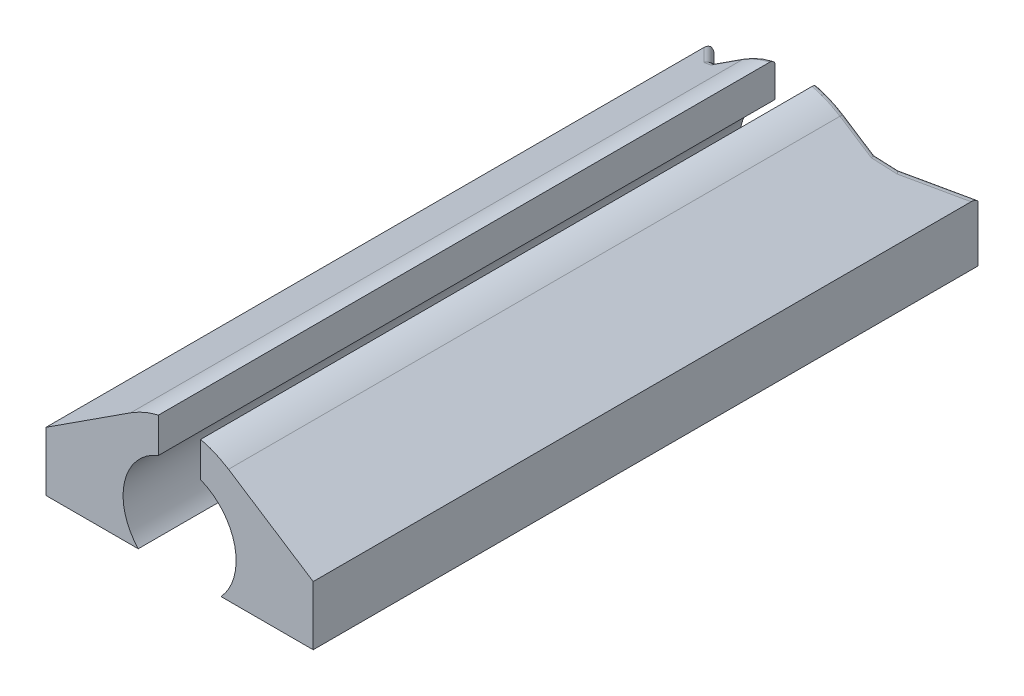
ISO-10303-21;
HEADER;
FILE_DESCRIPTION(('STEP AP214'),'2;1');
FILE_NAME('part.step','',(''),(''),'','','');
FILE_SCHEMA(('AUTOMOTIVE_DESIGN { 1 0 10303 214 1 1 1 1 }'));
ENDSEC;
DATA;
#1=APPLICATION_CONTEXT('core data for automotive mechanical design processes');
#2=APPLICATION_PROTOCOL_DEFINITION('international standard','automotive_design',2000,#1);
#3=PRODUCT_CONTEXT('',#1,'mechanical');
#4=PRODUCT('Part','Part','',(#3));
#5=PRODUCT_RELATED_PRODUCT_CATEGORY('part','',(#4));
#6=PRODUCT_DEFINITION_FORMATION('','',#4);
#7=PRODUCT_DEFINITION_CONTEXT('part definition',#1,'design');
#8=PRODUCT_DEFINITION('design','',#6,#7);
#9=PRODUCT_DEFINITION_SHAPE('','',#8);
#10=(LENGTH_UNIT() NAMED_UNIT(*) SI_UNIT(.MILLI.,.METRE.));
#11=(NAMED_UNIT(*) PLANE_ANGLE_UNIT() SI_UNIT($,.RADIAN.));
#12=(NAMED_UNIT(*) SI_UNIT($,.STERADIAN.) SOLID_ANGLE_UNIT());
#13=UNCERTAINTY_MEASURE_WITH_UNIT(LENGTH_MEASURE(1.E-05),#10,'distance_accuracy_value','');
#14=(GEOMETRIC_REPRESENTATION_CONTEXT(3) GLOBAL_UNCERTAINTY_ASSIGNED_CONTEXT((#13)) GLOBAL_UNIT_ASSIGNED_CONTEXT((#10,
#11,#12)) REPRESENTATION_CONTEXT('',''));
#15=CARTESIAN_POINT('',(0.,0.,0.));
#16=DIRECTION('',(0.,0.,1.));
#17=DIRECTION('',(1.,0.,0.));
#18=AXIS2_PLACEMENT_3D('',#15,#16,#17);
#19=CARTESIAN_POINT('',(0.,0.,-60.));
#20=DIRECTION('',(0.,0.,1.));
#21=DIRECTION('',(-1.,0.,0.));
#22=AXIS2_PLACEMENT_3D('',#19,#20,#21);
#23=PLANE('',#22);
#24=DIRECTION('',(0.,1.,0.));
#25=VECTOR('',#24,1.);
#26=CARTESIAN_POINT('',(14.8,10.4830044212181,-60.));
#27=LINE('',#26,#25);
#28=CARTESIAN_POINT('',(14.8,-7.5,-60.));
#29=VERTEX_POINT('',#28);
#30=CARTESIAN_POINT('',(14.8,9.7450540738367,-60.));
#31=VERTEX_POINT('',#30);
#32=EDGE_CURVE('E210',#29,#31,#27,.T.);
#33=ORIENTED_EDGE('',*,*,#32,.F.);
#34=DIRECTION('',(-1.,0.,0.));
#35=VECTOR('',#34,1.);
#36=CARTESIAN_POINT('',(0.,-7.5,-60.));
#37=LINE('',#36,#35);
#38=CARTESIAN_POINT('',(8.04673846971554,-7.5,-60.));
#39=VERTEX_POINT('',#38);
#40=EDGE_CURVE('E187',#29,#39,#37,.T.);
#41=ORIENTED_EDGE('',*,*,#40,.T.);
#42=CARTESIAN_POINT('',(0.,0.,-60.));
#43=DIRECTION('',(0.,0.,-1.));
#44=DIRECTION('',(-1.,0.,0.));
#45=AXIS2_PLACEMENT_3D('',#42,#43,#44);
#46=CIRCLE('',#45,11.);
#47=CARTESIAN_POINT('',(4.10000000000001,10.2073502928037,-60.));
#48=VERTEX_POINT('',#47);
#49=EDGE_CURVE('E161',#48,#39,#46,.T.);
#50=ORIENTED_EDGE('',*,*,#49,.F.);
#51=DIRECTION('',(0.,-1.,0.));
#52=VECTOR('',#51,1.);
#53=CARTESIAN_POINT('',(4.10000000000001,0.,-60.));
#54=LINE('',#53,#52);
#55=CARTESIAN_POINT('',(4.10000000000001,15.9824904192056,-60.));
#56=VERTEX_POINT('',#55);
#57=EDGE_CURVE('E172',#56,#48,#54,.T.);
#58=ORIENTED_EDGE('',*,*,#57,.F.);
#59=CARTESIAN_POINT('',(0.,0.,-60.));
#60=DIRECTION('',(0.,0.,-1.));
#61=DIRECTION('',(-1.,0.,0.));
#62=AXIS2_PLACEMENT_3D('',#59,#60,#61);
#63=CIRCLE('',#62,16.5);
#64=CARTESIAN_POINT('',(8.97575971599341,13.8450618460428,-60.));
#65=VERTEX_POINT('',#64);
#66=EDGE_CURVE('E215',#65,#56,#63,.F.);
#67=ORIENTED_EDGE('',*,*,#66,.F.);
#68=DIRECTION('',(-0.839094657335927,0.543985437332934,0.));
#69=VECTOR('',#68,1.);
#70=CARTESIAN_POINT('',(8.97575971599341,13.8450618460428,-60.));
#71=LINE('',#70,#69);
#72=CARTESIAN_POINT('',(14.8754013810746,10.0203215462104,-60.));
#73=VERTEX_POINT('',#72);
#74=EDGE_CURVE('E218',#73,#65,#71,.T.);
#75=ORIENTED_EDGE('',*,*,#74,.F.);
#76=CARTESIAN_POINT('',(16.8,8.772603410654,-60.));
#77=DIRECTION('',(0.,0.,-1.));
#78=DIRECTION('',(0.839094657335927,-0.543985437332934,0.));
#79=AXIS2_PLACEMENT_3D('',#76,#77,#78);
#80=ELLIPSE('',#79,2.29366091429529,1.);
#81=EDGE_CURVE('E12',#31,#73,#80,.T.);
#82=ORIENTED_EDGE('',*,*,#81,.F.);
#83=EDGE_LOOP('',(#33,#41,#50,#58,#67,#75,#82));
#84=FACE_BOUND('',#83,.T.);
#85=ADVANCED_FACE('F53',(#84),#23,.F.);
#86=CARTESIAN_POINT('',(0.,-7.5,60.));
#87=DIRECTION('',(0.,1.,0.));
#88=DIRECTION('',(1.,0.,0.));
#89=AXIS2_PLACEMENT_3D('',#86,#87,#88);
#90=PLANE('',#89);
#91=DIRECTION('',(0.,0.,-1.));
#92=VECTOR('',#91,1.);
#93=CARTESIAN_POINT('',(26.,-7.5,60.));
#94=LINE('',#93,#92);
#95=CARTESIAN_POINT('',(26.,-7.5,60.));
#96=VERTEX_POINT('',#95);
#97=CARTESIAN_POINT('',(26.,-7.5,-69.3788342917538));
#98=VERTEX_POINT('',#97);
#99=EDGE_CURVE('E171',#96,#98,#94,.T.);
#100=ORIENTED_EDGE('',*,*,#99,.F.);
#101=DIRECTION('',(-1.,0.,0.));
#102=VECTOR('',#101,1.);
#103=CARTESIAN_POINT('',(0.,-7.5,60.));
#104=LINE('',#103,#102);
#105=CARTESIAN_POINT('',(8.04673846971554,-7.5,60.));
#106=VERTEX_POINT('',#105);
#107=EDGE_CURVE('E150',#96,#106,#104,.T.);
#108=ORIENTED_EDGE('',*,*,#107,.T.);
#109=DIRECTION('',(0.,0.,-1.));
#110=VECTOR('',#109,1.);
#111=CARTESIAN_POINT('',(8.04673846971554,-7.5,60.));
#112=LINE('',#111,#110);
#113=EDGE_CURVE('E158',#106,#39,#112,.T.);
#114=ORIENTED_EDGE('',*,*,#113,.T.);
#115=ORIENTED_EDGE('',*,*,#40,.F.);
#116=DIRECTION('',(0.866025403784435,0.,-0.500000000000006));
#117=VECTOR('',#116,1.);
#118=CARTESIAN_POINT('',(-48.2615242270666,-7.49999999999999,-23.5914120119944));
#119=LINE('',#118,#117);
#120=CARTESIAN_POINT('',(17.6392304845414,-7.5,-61.6392304845414));
#121=VERTEX_POINT('',#120);
#122=EDGE_CURVE('E213',#121,#29,#119,.F.);
#123=ORIENTED_EDGE('',*,*,#122,.F.);
#124=DIRECTION('',(0.707106781186552,0.,-0.707106781186543));
#125=VECTOR('',#124,1.);
#126=CARTESIAN_POINT('',(26.,-7.5,-69.9999999999999));
#127=LINE('',#126,#125);
#128=CARTESIAN_POINT('',(25.1514718625761,-7.5,-69.151471862576));
#129=VERTEX_POINT('',#128);
#130=EDGE_CURVE('E177',#121,#129,#127,.T.);
#131=ORIENTED_EDGE('',*,*,#130,.T.);
#132=DIRECTION('',(-0.965925826289067,0.,0.258819045102525));
#133=VECTOR('',#132,1.);
#134=CARTESIAN_POINT('',(26.,-7.5,-69.3788342917538));
#135=LINE('',#134,#133);
#136=EDGE_CURVE('E202',#98,#129,#135,.T.);
#137=ORIENTED_EDGE('',*,*,#136,.F.);
#138=EDGE_LOOP('',(#100,#108,#114,#115,#123,#131,#137));
#139=FACE_BOUND('',#138,.T.);
#140=ADVANCED_FACE('F168',(#139),#90,.F.);
#141=CARTESIAN_POINT('',(0.,0.,60.));
#142=DIRECTION('',(0.,0.,-1.));
#143=DIRECTION('',(1.,0.,0.));
#144=AXIS2_PLACEMENT_3D('',#141,#142,#143);
#145=CYLINDRICAL_SURFACE('',#144,11.);
#146=ORIENTED_EDGE('',*,*,#49,.T.);
#147=ORIENTED_EDGE('',*,*,#113,.F.);
#148=CARTESIAN_POINT('',(0.,0.,60.));
#149=DIRECTION('',(0.,0.,-1.));
#150=DIRECTION('',(-1.,0.,0.));
#151=AXIS2_PLACEMENT_3D('',#148,#149,#150);
#152=CIRCLE('',#151,11.);
#153=CARTESIAN_POINT('',(4.10000000000001,10.2073502928037,60.));
#154=VERTEX_POINT('',#153);
#155=EDGE_CURVE('E146',#154,#106,#152,.T.);
#156=ORIENTED_EDGE('',*,*,#155,.F.);
#157=DIRECTION('',(0.,0.,-1.));
#158=VECTOR('',#157,1.);
#159=CARTESIAN_POINT('',(4.10000000000001,10.2073502928037,60.));
#160=LINE('',#159,#158);
#161=EDGE_CURVE('E166',#154,#48,#160,.T.);
#162=ORIENTED_EDGE('',*,*,#161,.T.);
#163=EDGE_LOOP('',(#146,#147,#156,#162));
#164=FACE_BOUND('',#163,.T.);
#165=ADVANCED_FACE('F159',(#164),#145,.F.);
#166=CARTESIAN_POINT('',(4.10000000000001,0.,60.));
#167=DIRECTION('',(-1.,0.,0.));
#168=DIRECTION('',(0.,0.,-1.));
#169=AXIS2_PLACEMENT_3D('',#166,#167,#168);
#170=PLANE('',#169);
#171=ORIENTED_EDGE('',*,*,#57,.T.);
#172=ORIENTED_EDGE('',*,*,#161,.F.);
#173=DIRECTION('',(0.,-1.,0.));
#174=VECTOR('',#173,1.);
#175=CARTESIAN_POINT('',(4.10000000000001,0.,60.));
#176=LINE('',#175,#174);
#177=CARTESIAN_POINT('',(4.10000000000001,17.0129362545094,60.));
#178=VERTEX_POINT('',#177);
#179=EDGE_CURVE('E153',#178,#154,#176,.T.);
#180=ORIENTED_EDGE('',*,*,#179,.F.);
#181=DIRECTION('',(0.,0.,-1.));
#182=VECTOR('',#181,1.);
#183=CARTESIAN_POINT('',(4.10000000000001,17.0129362545094,60.));
#184=LINE('',#183,#182);
#185=CARTESIAN_POINT('',(4.10000000000001,17.0129362545094,-59.));
#186=VERTEX_POINT('',#185);
#187=EDGE_CURVE('E197',#178,#186,#184,.T.);
#188=ORIENTED_EDGE('',*,*,#187,.T.);
#189=CARTESIAN_POINT('',(4.10000000000001,15.9824904192056,-60.));
#190=CARTESIAN_POINT('',(4.10000000000001,16.0418203107306,-60.0000423199138));
#191=CARTESIAN_POINT('',(4.10000000000001,16.101149826966,-59.995048083426));
#192=CARTESIAN_POINT('',(4.10000000000001,16.2181655923714,-59.9752613891248));
#193=CARTESIAN_POINT('',(4.10000000000001,16.2758514670217,-59.9604667165167));
#194=CARTESIAN_POINT('',(4.10000000000001,16.3879581507829,-59.9213371553985));
#195=CARTESIAN_POINT('',(4.10000000000001,16.4423760578724,-59.8969939279167));
#196=CARTESIAN_POINT('',(4.10000000000001,16.5462356142313,-59.8393784946179));
#197=CARTESIAN_POINT('',(4.10000000000001,16.5956796340957,-59.8061105703727));
#198=CARTESIAN_POINT('',(4.10000000000001,16.6872911081194,-59.7321231346246));
#199=CARTESIAN_POINT('',(4.10000000000001,16.7295655385417,-59.691536198512));
#200=CARTESIAN_POINT('',(4.10000000000001,16.8064634693826,-59.6036405859423));
#201=CARTESIAN_POINT('',(4.10000000000001,16.8410859642524,-59.556331027399));
#202=CARTESIAN_POINT('',(4.10000000000001,16.9006235057997,-59.4578104061437));
#203=CARTESIAN_POINT('',(4.10000000000001,16.9257884532279,-59.4067501266514));
#204=CARTESIAN_POINT('',(4.10000000000001,16.9669210088798,-59.3010747318077));
#205=CARTESIAN_POINT('',(4.10000000000001,16.9828978775942,-59.2464632576666));
#206=CARTESIAN_POINT('',(4.10000000000001,17.0003053773164,-59.1594894427613));
#207=CARTESIAN_POINT('',(4.10000000000001,17.0050396330188,-59.127753558029));
#208=CARTESIAN_POINT('',(4.10000000000001,17.0113537650882,-59.0640169949094));
#209=CARTESIAN_POINT('',(4.10000000000001,17.0129382923981,-59.0320167771123));
#210=CARTESIAN_POINT('',(4.10000000000001,17.0129362545094,-59.));
#211=B_SPLINE_CURVE_WITH_KNOTS('',3,(#189,#190,#191,#192,#193,#194,#195,#196,#197,#198,#199,
#200,#201,#202,#203,#204,#205,#206,#207,#208,#209,#210),.UNSPECIFIED.,.F.,.F.,(4,2,2,2,2,2,2,2,
2,2,4),(0.,0.177781479469305,0.355603149382926,0.533580462038742,0.71147254332309,
0.886417610297477,1.06138565333153,1.23133630159282,1.40111535825444,1.49723608923946,
1.59321478096192),.UNSPECIFIED.);
#212=EDGE_CURVE('E240',#56,#186,#211,.T.);
#213=ORIENTED_EDGE('',*,*,#212,.F.);
#214=EDGE_LOOP('',(#171,#172,#180,#188,#213));
#215=FACE_BOUND('',#214,.T.);
#216=ADVANCED_FACE('F252',(#215),#170,.T.);
#217=CARTESIAN_POINT('',(0.,0.,60.));
#218=DIRECTION('',(0.,0.,-1.));
#219=DIRECTION('',(1.,0.,0.));
#220=AXIS2_PLACEMENT_3D('',#217,#218,#219);
#221=CYLINDRICAL_SURFACE('',#220,17.5);
#222=ORIENTED_EDGE('',*,*,#187,.F.);
#223=CARTESIAN_POINT('',(0.,0.,60.));
#224=DIRECTION('',(0.,0.,-1.));
#225=DIRECTION('',(-1.,0.,0.));
#226=AXIS2_PLACEMENT_3D('',#223,#224,#225);
#227=CIRCLE('',#226,17.5);
#228=CARTESIAN_POINT('',(9.51974515332635,14.6841565033787,60.));
#229=VERTEX_POINT('',#228);
#230=EDGE_CURVE('E180',#178,#229,#227,.T.);
#231=ORIENTED_EDGE('',*,*,#230,.T.);
#232=DIRECTION('',(0.,0.,-1.));
#233=VECTOR('',#232,1.);
#234=CARTESIAN_POINT('',(9.51974515332635,14.6841565033787,60.));
#235=LINE('',#234,#233);
#236=CARTESIAN_POINT('',(9.51974515332635,14.6841565033787,-59.));
#237=VERTEX_POINT('',#236);
#238=EDGE_CURVE('E194',#229,#237,#235,.T.);
#239=ORIENTED_EDGE('',*,*,#238,.T.);
#240=CARTESIAN_POINT('',(0.,0.,-59.));
#241=DIRECTION('',(0.,0.,-1.));
#242=DIRECTION('',(-1.,0.,0.));
#243=AXIS2_PLACEMENT_3D('',#240,#241,#242);
#244=CIRCLE('',#243,17.5);
#245=EDGE_CURVE('E237',#186,#237,#244,.T.);
#246=ORIENTED_EDGE('',*,*,#245,.F.);
#247=EDGE_LOOP('',(#222,#231,#239,#246));
#248=FACE_BOUND('',#247,.T.);
#249=ADVANCED_FACE('F257',(#248),#221,.T.);
#250=CARTESIAN_POINT('',(9.51974515332634,14.6841565033787,60.));
#251=DIRECTION('',(0.543985437332934,0.839094657335927,0.));
#252=DIRECTION('',(0.839094657335927,-0.543985437332934,0.));
#253=AXIS2_PLACEMENT_3D('',#250,#251,#252);
#254=PLANE('',#253);
#255=ORIENTED_EDGE('',*,*,#238,.F.);
#256=DIRECTION('',(-0.839094657335927,0.543985437332934,0.));
#257=VECTOR('',#256,1.);
#258=CARTESIAN_POINT('',(9.51974515332634,14.6841565033787,60.));
#259=LINE('',#258,#257);
#260=CARTESIAN_POINT('',(26.,4.,60.));
#261=VERTEX_POINT('',#260);
#262=EDGE_CURVE('E183',#261,#229,#259,.T.);
#263=ORIENTED_EDGE('',*,*,#262,.F.);
#264=DIRECTION('',(0.,0.,-1.));
#265=VECTOR('',#264,1.);
#266=CARTESIAN_POINT('',(26.,4.,60.));
#267=LINE('',#266,#265);
#268=CARTESIAN_POINT('',(26.,4.,-68.0418010002939));
#269=VERTEX_POINT('',#268);
#270=EDGE_CURVE('E191',#261,#269,#267,.T.);
#271=ORIENTED_EDGE('',*,*,#270,.T.);
#272=DIRECTION('',(-0.64278537377085,0.416718042005079,0.642785373770843));
#273=VECTOR('',#272,1.);
#274=CARTESIAN_POINT('',(25.9605468898136,4.02557746877691,-68.0023478901075));
#275=LINE('',#274,#273);
#276=CARTESIAN_POINT('',(18.7972303292566,8.66955876204451,-60.8390313295506));
#277=VERTEX_POINT('',#276);
#278=EDGE_CURVE('E222',#277,#269,#275,.F.);
#279=ORIENTED_EDGE('',*,*,#278,.F.);
#280=DIRECTION('',(-0.755146847022509,0.489562034791587,0.435984235406149));
#281=VECTOR('',#280,1.);
#282=CARTESIAN_POINT('',(18.1227969693985,9.10679420742223,-60.4496470476861));
#283=LINE('',#282,#281);
#284=CARTESIAN_POINT('',(15.6119346297641,10.7345873723143,-59.));
#285=VERTEX_POINT('',#284);
#286=EDGE_CURVE('E220',#285,#277,#283,.F.);
#287=ORIENTED_EDGE('',*,*,#286,.F.);
#288=DIRECTION('',(-0.839094657335927,0.543985437332934,0.));
#289=VECTOR('',#288,1.);
#290=CARTESIAN_POINT('',(14.8,11.2609649517643,-59.));
#291=LINE('',#290,#289);
#292=EDGE_CURVE('E225',#237,#285,#291,.F.);
#293=ORIENTED_EDGE('',*,*,#292,.F.);
#294=EDGE_LOOP('',(#255,#263,#271,#279,#287,#293));
#295=FACE_BOUND('',#294,.T.);
#296=ADVANCED_FACE('F290',(#295),#254,.T.);
#297=CARTESIAN_POINT('',(26.,0.,60.));
#298=DIRECTION('',(1.,0.,0.));
#299=DIRECTION('',(0.,0.,1.));
#300=AXIS2_PLACEMENT_3D('',#297,#298,#299);
#301=PLANE('',#300);
#302=ORIENTED_EDGE('',*,*,#270,.F.);
#303=DIRECTION('',(0.,1.,0.));
#304=VECTOR('',#303,1.);
#305=CARTESIAN_POINT('',(26.,0.,60.));
#306=LINE('',#305,#304);
#307=EDGE_CURVE('E185',#96,#261,#306,.T.);
#308=ORIENTED_EDGE('',*,*,#307,.F.);
#309=ORIENTED_EDGE('',*,*,#99,.T.);
#310=DIRECTION('',(0.,-1.,0.));
#311=VECTOR('',#310,1.);
#312=CARTESIAN_POINT('',(26.,-7.5,-69.3788342917538));
#313=LINE('',#312,#311);
#314=CARTESIAN_POINT('',(26.,3.46199707217257,-69.3788342917538));
#315=VERTEX_POINT('',#314);
#316=EDGE_CURVE('E165',#315,#98,#313,.T.);
#317=ORIENTED_EDGE('',*,*,#316,.F.);
#318=CARTESIAN_POINT('',(26.,2.8082393431333,-68.5857864376268));
#319=DIRECTION('',(-1.,0.,0.));
#320=DIRECTION('',(0.,-0.543985437332939,-0.839094657335924));
#321=AXIS2_PLACEMENT_3D('',#318,#319,#320);
#322=ELLIPSE('',#321,1.55572923841371,1.);
#323=EDGE_CURVE('E230',#269,#315,#322,.T.);
#324=ORIENTED_EDGE('',*,*,#323,.F.);
#325=EDGE_LOOP('',(#302,#308,#309,#317,#324));
#326=FACE_BOUND('',#325,.T.);
#327=ADVANCED_FACE('F288',(#326),#301,.T.);
#328=CARTESIAN_POINT('',(0.,0.,60.));
#329=DIRECTION('',(0.,0.,1.));
#330=DIRECTION('',(-1.,0.,0.));
#331=AXIS2_PLACEMENT_3D('',#328,#329,#330);
#332=PLANE('',#331);
#333=ORIENTED_EDGE('',*,*,#107,.F.);
#334=ORIENTED_EDGE('',*,*,#307,.T.);
#335=ORIENTED_EDGE('',*,*,#262,.T.);
#336=ORIENTED_EDGE('',*,*,#230,.F.);
#337=ORIENTED_EDGE('',*,*,#179,.T.);
#338=ORIENTED_EDGE('',*,*,#155,.T.);
#339=EDGE_LOOP('',(#333,#334,#335,#336,#337,#338));
#340=FACE_BOUND('',#339,.T.);
#341=ADVANCED_FACE('F148',(#340),#332,.T.);
#342=CARTESIAN_POINT('',(26.,11.,-69.9999999999999));
#343=DIRECTION('',(0.707106781186543,0.,0.707106781186552));
#344=DIRECTION('',(-0.707106781186552,0.,0.707106781186543));
#345=AXIS2_PLACEMENT_3D('',#342,#343,#344);
#346=PLANE('',#345);
#347=DIRECTION('',(0.,1.,0.));
#348=VECTOR('',#347,1.);
#349=CARTESIAN_POINT('',(25.1514718625761,4.,-69.151471862576));
#350=LINE('',#349,#348);
#351=CARTESIAN_POINT('',(25.1514718625761,2.89992287090742,-69.151471862576));
#352=VERTEX_POINT('',#351);
#353=EDGE_CURVE('E207',#129,#352,#350,.T.);
#354=ORIENTED_EDGE('',*,*,#353,.F.);
#355=ORIENTED_EDGE('',*,*,#130,.F.);
#356=DIRECTION('',(0.,-1.,0.));
#357=VECTOR('',#356,1.);
#358=CARTESIAN_POINT('',(17.6392304845414,-7.5,-61.6392304845414));
#359=LINE('',#358,#357);
#360=CARTESIAN_POINT('',(17.6392304845414,7.77011227761314,-61.6392304845414));
#361=VERTEX_POINT('',#360);
#362=EDGE_CURVE('E205',#361,#121,#359,.T.);
#363=ORIENTED_EDGE('',*,*,#362,.F.);
#364=DIRECTION('',(-0.64278537377085,0.416718042005079,0.642785373770843));
#365=VECTOR('',#364,1.);
#366=CARTESIAN_POINT('',(17.1972132932594,8.05667221814671,-61.1972132932594));
#367=LINE('',#366,#365);
#368=EDGE_CURVE('E227',#352,#361,#367,.T.);
#369=ORIENTED_EDGE('',*,*,#368,.F.);
#370=EDGE_LOOP('',(#354,#355,#363,#369));
#371=FACE_BOUND('',#370,.T.);
#372=ADVANCED_FACE('F268',(#371),#346,.F.);
#373=CARTESIAN_POINT('',(26.,0.,-69.3788342917538));
#374=DIRECTION('',(-0.258819045102525,0.,-0.965925826289067));
#375=DIRECTION('',(0.,1.,0.));
#376=AXIS2_PLACEMENT_3D('',#373,#374,#375);
#377=PLANE('',#376);
#378=ORIENTED_EDGE('',*,*,#316,.T.);
#379=ORIENTED_EDGE('',*,*,#136,.T.);
#380=ORIENTED_EDGE('',*,*,#353,.T.);
#381=CARTESIAN_POINT('',(27.0833235151543,2.10592022929781,-69.6691099527811));
#382=DIRECTION('',(0.258819045102525,0.,0.965925826289067));
#383=DIRECTION('',(0.853700637730929,-0.467834791625983,-0.228748396457941));
#384=AXIS2_PLACEMENT_3D('',#381,#382,#383);
#385=ELLIPSE('',#384,2.20013338834509,1.);
#386=EDGE_CURVE('E233',#315,#352,#385,.T.);
#387=ORIENTED_EDGE('',*,*,#386,.F.);
#388=EDGE_LOOP('',(#378,#379,#380,#387));
#389=FACE_BOUND('',#388,.T.);
#390=ADVANCED_FACE('F264',(#389),#377,.T.);
#391=CARTESIAN_POINT('',(17.6392304845414,11.,-61.6392304845414));
#392=DIRECTION('',(-0.500000000000006,0.,-0.866025403784435));
#393=DIRECTION('',(0.,1.,0.));
#394=AXIS2_PLACEMENT_3D('',#391,#392,#393);
#395=PLANE('',#394);
#396=CARTESIAN_POINT('',(20.9852956994927,6.05927435826232,-63.5710821371196));
#397=DIRECTION('',(0.500000000000006,0.,0.866025403784435));
#398=DIRECTION('',(0.782385886373355,-0.42875373631612,-0.451710702107827));
#399=AXIS2_PLACEMENT_3D('',#396,#397,#398);
#400=ELLIPSE('',#399,4.25033132216693,1.);
#401=CARTESIAN_POINT('',(17.6630422300997,7.88894253024964,-61.6529782022494));
#402=VERTEX_POINT('',#401);
#403=EDGE_CURVE('E62',#361,#402,#400,.F.);
#404=ORIENTED_EDGE('',*,*,#403,.F.);
#405=ORIENTED_EDGE('',*,*,#362,.T.);
#406=ORIENTED_EDGE('',*,*,#122,.T.);
#407=ORIENTED_EDGE('',*,*,#32,.T.);
#408=DIRECTION('',(0.755146847022509,-0.489562034791587,-0.435984235406149));
#409=VECTOR('',#408,1.);
#410=CARTESIAN_POINT('',(14.2395810475242,10.1083739285002,-59.6764419669291));
#411=LINE('',#410,#409);
#412=EDGE_CURVE('E235',#402,#31,#411,.F.);
#413=ORIENTED_EDGE('',*,*,#412,.F.);
#414=EDGE_LOOP('',(#404,#405,#406,#407,#413));
#415=FACE_BOUND('',#414,.T.);
#416=ADVANCED_FACE('F267',(#415),#395,.T.);
#417=CARTESIAN_POINT('',(24.3900677531935,3.85195913052412,-66.9758541908203));
#418=DIRECTION('',(0.64278537377085,-0.416718042005079,-0.642785373770843));
#419=DIRECTION('',(0.707106781186543,0.,0.707106781186552));
#420=AXIS2_PLACEMENT_3D('',#417,#418,#419);
#421=CYLINDRICAL_SURFACE('',#420,1.);
#422=ORIENTED_EDGE('',*,*,#323,.T.);
#423=ORIENTED_EDGE('',*,*,#386,.T.);
#424=ORIENTED_EDGE('',*,*,#368,.T.);
#425=ORIENTED_EDGE('',*,*,#403,.T.);
#426=CARTESIAN_POINT('',(18.2532448919238,7.83046410470852,-60.8390313295507));
#427=DIRECTION('',(-0.704330475171241,0.456617758453384,0.543524428531102));
#428=DIRECTION('',(-0.456068444112011,0.295669373955625,-0.839393349741311));
#429=AXIS2_PLACEMENT_3D('',#426,#427,#428);
#430=ELLIPSE('',#429,1.0076747136875,1.);
#431=EDGE_CURVE('E57',#402,#277,#430,.F.);
#432=ORIENTED_EDGE('',*,*,#431,.T.);
#433=ORIENTED_EDGE('',*,*,#278,.T.);
#434=EDGE_LOOP('',(#422,#423,#424,#425,#432,#433));
#435=FACE_BOUND('',#434,.T.);
#436=ADVANCED_FACE('F55',(#435),#421,.T.);
#437=CARTESIAN_POINT('',(-29.0448455449364,38.4938370464426,-33.5314660836738));
#438=DIRECTION('',(0.755146847022509,-0.489562034791587,-0.435984235406149));
#439=DIRECTION('',(-0.543985437332934,-0.839094657335927,0.));
#440=AXIS2_PLACEMENT_3D('',#437,#438,#439);
#441=CYLINDRICAL_SURFACE('',#440,1.);
#442=ORIENTED_EDGE('',*,*,#431,.F.);
#443=ORIENTED_EDGE('',*,*,#412,.T.);
#444=ORIENTED_EDGE('',*,*,#81,.T.);
#445=CARTESIAN_POINT('',(15.0679491924312,9.89549271497831,-59.));
#446=DIRECTION('',(-0.817838470851779,0.530205042237438,0.223657883341544));
#447=DIRECTION('',(0.187670134982952,-0.121666631482508,0.974667713233172));
#448=AXIS2_PLACEMENT_3D('',#445,#446,#447);
#449=ELLIPSE('',#448,1.02599069038903,1.);
#450=EDGE_CURVE('E77',#73,#285,#449,.F.);
#451=ORIENTED_EDGE('',*,*,#450,.T.);
#452=ORIENTED_EDGE('',*,*,#286,.T.);
#453=EDGE_LOOP('',(#442,#443,#444,#451,#452));
#454=FACE_BOUND('',#453,.T.);
#455=ADVANCED_FACE('F277',(#454),#441,.T.);
#456=CARTESIAN_POINT('',(0.,0.,-59.));
#457=DIRECTION('',(0.,0.,1.));
#458=DIRECTION('',(-1.,0.,0.));
#459=AXIS2_PLACEMENT_3D('',#456,#457,#458);
#460=TOROIDAL_SURFACE('',#459,16.5,1.);
#461=ORIENTED_EDGE('',*,*,#212,.T.);
#462=ORIENTED_EDGE('',*,*,#245,.T.);
#463=CARTESIAN_POINT('',(8.97575971599342,13.8450618460428,-59.));
#464=DIRECTION('',(-0.839094657335927,0.543985437332934,0.));
#465=DIRECTION('',(-0.543985437332934,-0.839094657335927,0.));
#466=AXIS2_PLACEMENT_3D('',#463,#464,#465);
#467=CIRCLE('',#466,1.);
#468=EDGE_CURVE('E310',#237,#65,#467,.T.);
#469=ORIENTED_EDGE('',*,*,#468,.T.);
#470=ORIENTED_EDGE('',*,*,#66,.T.);
#471=EDGE_LOOP('',(#461,#462,#469,#470));
#472=FACE_BOUND('',#471,.T.);
#473=ADVANCED_FACE('F249',(#472),#460,.T.);
#474=CARTESIAN_POINT('',(8.97575971599341,13.8450618460428,-59.));
#475=DIRECTION('',(0.839094657335927,-0.543985437332934,0.));
#476=DIRECTION('',(-0.543985437332934,-0.839094657335927,0.));
#477=AXIS2_PLACEMENT_3D('',#474,#475,#476);
#478=CYLINDRICAL_SURFACE('',#477,1.);
#479=ORIENTED_EDGE('',*,*,#450,.F.);
#480=ORIENTED_EDGE('',*,*,#74,.T.);
#481=ORIENTED_EDGE('',*,*,#468,.F.);
#482=ORIENTED_EDGE('',*,*,#292,.T.);
#483=EDGE_LOOP('',(#479,#480,#481,#482));
#484=FACE_BOUND('',#483,.T.);
#485=ADVANCED_FACE('F272',(#484),#478,.T.);
#486=CLOSED_SHELL('',(#85,#140,#165,#216,#249,#296,#327,#341,#372,#390,#416,#436,#455,#473,#485));
#487=MANIFOLD_SOLID_BREP('B2',#486);
#488=CARTESIAN_POINT('',(0.,0.,-60.));
#489=DIRECTION('',(0.,0.,1.));
#490=DIRECTION('',(1.,0.,0.));
#491=AXIS2_PLACEMENT_3D('',#488,#489,#490);
#492=PLANE('',#491);
#493=DIRECTION('',(0.,1.,0.));
#494=VECTOR('',#493,1.);
#495=CARTESIAN_POINT('',(-14.8,10.4830044212181,-60.));
#496=LINE('',#495,#494);
#497=CARTESIAN_POINT('',(-14.8,-7.5,-60.));
#498=VERTEX_POINT('',#497);
#499=CARTESIAN_POINT('',(-14.8,9.7450540738367,-60.));
#500=VERTEX_POINT('',#499);
#501=EDGE_CURVE('E605',#498,#500,#496,.T.);
#502=ORIENTED_EDGE('',*,*,#501,.T.);
#503=CARTESIAN_POINT('',(-16.8,8.772603410654,-60.));
#504=DIRECTION('',(0.,0.,1.));
#505=DIRECTION('',(-0.839094657335927,-0.543985437332934,0.));
#506=AXIS2_PLACEMENT_3D('',#503,#504,#505);
#507=ELLIPSE('',#506,2.29366091429529,1.);
#508=CARTESIAN_POINT('',(-14.8754013810746,10.0203215462104,-60.));
#509=VERTEX_POINT('',#508);
#510=EDGE_CURVE('E51',#500,#509,#507,.T.);
#511=ORIENTED_EDGE('',*,*,#510,.T.);
#512=DIRECTION('',(0.839094657335927,0.543985437332934,0.));
#513=VECTOR('',#512,1.);
#514=CARTESIAN_POINT('',(-8.97575971599341,13.8450618460428,-60.));
#515=LINE('',#514,#513);
#516=CARTESIAN_POINT('',(-8.97575971599341,13.8450618460428,-60.));
#517=VERTEX_POINT('',#516);
#518=EDGE_CURVE('E452',#509,#517,#515,.T.);
#519=ORIENTED_EDGE('',*,*,#518,.T.);
#520=CARTESIAN_POINT('',(0.,0.,-60.));
#521=DIRECTION('',(0.,0.,1.));
#522=DIRECTION('',(1.,0.,0.));
#523=AXIS2_PLACEMENT_3D('',#520,#521,#522);
#524=CIRCLE('',#523,16.5);
#525=CARTESIAN_POINT('',(-4.10000000000001,15.9824904192056,-60.));
#526=VERTEX_POINT('',#525);
#527=EDGE_CURVE('E612',#517,#526,#524,.F.);
#528=ORIENTED_EDGE('',*,*,#527,.T.);
#529=DIRECTION('',(0.,-1.,0.));
#530=VECTOR('',#529,1.);
#531=CARTESIAN_POINT('',(-4.10000000000001,0.,-60.));
#532=LINE('',#531,#530);
#533=CARTESIAN_POINT('',(-4.10000000000001,10.2073502928037,-60.));
#534=VERTEX_POINT('',#533);
#535=EDGE_CURVE('E536',#526,#534,#532,.T.);
#536=ORIENTED_EDGE('',*,*,#535,.T.);
#537=CARTESIAN_POINT('',(0.,0.,-60.));
#538=DIRECTION('',(0.,0.,1.));
#539=DIRECTION('',(1.,0.,0.));
#540=AXIS2_PLACEMENT_3D('',#537,#538,#539);
#541=CIRCLE('',#540,11.);
#542=CARTESIAN_POINT('',(-8.04673846971554,-7.5,-60.));
#543=VERTEX_POINT('',#542);
#544=EDGE_CURVE('E571',#534,#543,#541,.T.);
#545=ORIENTED_EDGE('',*,*,#544,.T.);
#546=DIRECTION('',(1.,0.,0.));
#547=VECTOR('',#546,1.);
#548=CARTESIAN_POINT('',(0.,-7.5,-60.));
#549=LINE('',#548,#547);
#550=EDGE_CURVE('E542',#498,#543,#549,.T.);
#551=ORIENTED_EDGE('',*,*,#550,.F.);
#552=EDGE_LOOP('',(#502,#511,#519,#528,#536,#545,#551));
#553=FACE_BOUND('',#552,.T.);
#554=ADVANCED_FACE('F426',(#553),#492,.F.);
#555=CARTESIAN_POINT('',(0.,-7.5,60.));
#556=DIRECTION('',(0.,1.,0.));
#557=DIRECTION('',(-1.,0.,0.));
#558=AXIS2_PLACEMENT_3D('',#555,#556,#557);
#559=PLANE('',#558);
#560=DIRECTION('',(0.,0.,-1.));
#561=VECTOR('',#560,1.);
#562=CARTESIAN_POINT('',(-26.,-7.5,60.));
#563=LINE('',#562,#561);
#564=CARTESIAN_POINT('',(-26.,-7.5,60.));
#565=VERTEX_POINT('',#564);
#566=CARTESIAN_POINT('',(-26.,-7.5,-69.3788342917538));
#567=VERTEX_POINT('',#566);
#568=EDGE_CURVE('E568',#565,#567,#563,.T.);
#569=ORIENTED_EDGE('',*,*,#568,.T.);
#570=DIRECTION('',(0.965925826289067,0.,0.258819045102525));
#571=VECTOR('',#570,1.);
#572=CARTESIAN_POINT('',(-26.,-7.5,-69.3788342917538));
#573=LINE('',#572,#571);
#574=CARTESIAN_POINT('',(-25.1514718625761,-7.5,-69.151471862576));
#575=VERTEX_POINT('',#574);
#576=EDGE_CURVE('E595',#567,#575,#573,.T.);
#577=ORIENTED_EDGE('',*,*,#576,.T.);
#578=DIRECTION('',(-0.707106781186552,0.,-0.707106781186543));
#579=VECTOR('',#578,1.);
#580=CARTESIAN_POINT('',(-26.,-7.5,-69.9999999999999));
#581=LINE('',#580,#579);
#582=CARTESIAN_POINT('',(-17.6392304845414,-7.5,-61.6392304845414));
#583=VERTEX_POINT('',#582);
#584=EDGE_CURVE('E572',#583,#575,#581,.T.);
#585=ORIENTED_EDGE('',*,*,#584,.F.);
#586=DIRECTION('',(-0.866025403784435,0.,-0.500000000000006));
#587=VECTOR('',#586,1.);
#588=CARTESIAN_POINT('',(48.2615242270666,-7.49999999999999,-23.5914120119944));
#589=LINE('',#588,#587);
#590=EDGE_CURVE('E609',#583,#498,#589,.F.);
#591=ORIENTED_EDGE('',*,*,#590,.T.);
#592=ORIENTED_EDGE('',*,*,#550,.T.);
#593=DIRECTION('',(0.,0.,-1.));
#594=VECTOR('',#593,1.);
#595=CARTESIAN_POINT('',(-8.04673846971554,-7.5,60.));
#596=LINE('',#595,#594);
#597=CARTESIAN_POINT('',(-8.04673846971554,-7.5,60.));
#598=VERTEX_POINT('',#597);
#599=EDGE_CURVE('E539',#598,#543,#596,.T.);
#600=ORIENTED_EDGE('',*,*,#599,.F.);
#601=DIRECTION('',(1.,0.,0.));
#602=VECTOR('',#601,1.);
#603=CARTESIAN_POINT('',(0.,-7.5,60.));
#604=LINE('',#603,#602);
#605=EDGE_CURVE('E523',#565,#598,#604,.T.);
#606=ORIENTED_EDGE('',*,*,#605,.F.);
#607=EDGE_LOOP('',(#569,#577,#585,#591,#592,#600,#606));
#608=FACE_BOUND('',#607,.T.);
#609=ADVANCED_FACE('F540',(#608),#559,.F.);
#610=CARTESIAN_POINT('',(0.,0.,60.));
#611=DIRECTION('',(0.,0.,-1.));
#612=DIRECTION('',(-1.,0.,0.));
#613=AXIS2_PLACEMENT_3D('',#610,#611,#612);
#614=CYLINDRICAL_SURFACE('',#613,11.);
#615=ORIENTED_EDGE('',*,*,#544,.F.);
#616=DIRECTION('',(0.,0.,-1.));
#617=VECTOR('',#616,1.);
#618=CARTESIAN_POINT('',(-4.10000000000001,10.2073502928037,60.));
#619=LINE('',#618,#617);
#620=CARTESIAN_POINT('',(-4.10000000000001,10.2073502928037,60.));
#621=VERTEX_POINT('',#620);
#622=EDGE_CURVE('E548',#621,#534,#619,.T.);
#623=ORIENTED_EDGE('',*,*,#622,.F.);
#624=CARTESIAN_POINT('',(0.,0.,60.));
#625=DIRECTION('',(0.,0.,1.));
#626=DIRECTION('',(1.,0.,0.));
#627=AXIS2_PLACEMENT_3D('',#624,#625,#626);
#628=CIRCLE('',#627,11.);
#629=EDGE_CURVE('E528',#621,#598,#628,.T.);
#630=ORIENTED_EDGE('',*,*,#629,.T.);
#631=ORIENTED_EDGE('',*,*,#599,.T.);
#632=EDGE_LOOP('',(#615,#623,#630,#631));
#633=FACE_BOUND('',#632,.T.);
#634=ADVANCED_FACE('F550',(#633),#614,.F.);
#635=CARTESIAN_POINT('',(-4.10000000000001,0.,60.));
#636=DIRECTION('',(1.,0.,0.));
#637=DIRECTION('',(0.,0.,-1.));
#638=AXIS2_PLACEMENT_3D('',#635,#636,#637);
#639=PLANE('',#638);
#640=ORIENTED_EDGE('',*,*,#535,.F.);
#641=CARTESIAN_POINT('',(-4.10000000000001,15.9824904192056,-60.));
#642=CARTESIAN_POINT('',(-4.10000000000001,16.0418203107306,-60.0000423199138));
#643=CARTESIAN_POINT('',(-4.10000000000001,16.101149826966,-59.995048083426));
#644=CARTESIAN_POINT('',(-4.10000000000001,16.2181655923714,-59.9752613891248));
#645=CARTESIAN_POINT('',(-4.10000000000001,16.2758514670217,-59.9604667165167));
#646=CARTESIAN_POINT('',(-4.10000000000001,16.3879581507829,-59.9213371553985));
#647=CARTESIAN_POINT('',(-4.10000000000001,16.4423760578724,-59.8969939279167));
#648=CARTESIAN_POINT('',(-4.10000000000001,16.5462356142313,-59.8393784946179));
#649=CARTESIAN_POINT('',(-4.10000000000001,16.5956796340957,-59.8061105703727));
#650=CARTESIAN_POINT('',(-4.10000000000001,16.6872911081194,-59.7321231346246));
#651=CARTESIAN_POINT('',(-4.10000000000001,16.7295655385417,-59.691536198512));
#652=CARTESIAN_POINT('',(-4.10000000000001,16.8064634693826,-59.6036405859423));
#653=CARTESIAN_POINT('',(-4.10000000000001,16.8410859642524,-59.556331027399));
#654=CARTESIAN_POINT('',(-4.10000000000001,16.9006235057997,-59.4578104061437));
#655=CARTESIAN_POINT('',(-4.10000000000001,16.9257884532279,-59.4067501266514));
#656=CARTESIAN_POINT('',(-4.10000000000001,16.9669210088798,-59.3010747318077));
#657=CARTESIAN_POINT('',(-4.10000000000001,16.9828978775942,-59.2464632576666));
#658=CARTESIAN_POINT('',(-4.10000000000001,17.0003053773164,-59.1594894427613));
#659=CARTESIAN_POINT('',(-4.10000000000001,17.0050396330188,-59.127753558029));
#660=CARTESIAN_POINT('',(-4.10000000000001,17.0113537650882,-59.0640169949094));
#661=CARTESIAN_POINT('',(-4.10000000000001,17.0129382923981,-59.0320167771123));
#662=CARTESIAN_POINT('',(-4.10000000000001,17.0129362545094,-59.));
#663=B_SPLINE_CURVE_WITH_KNOTS('',3,(#641,#642,#643,#644,#645,#646,#647,#648,#649,#650,#651,
#652,#653,#654,#655,#656,#657,#658,#659,#660,#661,#662),.UNSPECIFIED.,.F.,.F.,(4,2,2,2,2,2,2,2,
2,2,4),(0.,0.177781479469305,0.355603149382926,0.533580462038742,0.71147254332309,
0.886417610297477,1.06138565333153,1.23133630159282,1.40111535825444,1.49723608923946,
1.59321478096192),.UNSPECIFIED.);
#664=CARTESIAN_POINT('',(-4.10000000000001,17.0129362545094,-59.));
#665=VERTEX_POINT('',#664);
#666=EDGE_CURVE('E640',#526,#665,#663,.T.);
#667=ORIENTED_EDGE('',*,*,#666,.T.);
#668=DIRECTION('',(0.,0.,-1.));
#669=VECTOR('',#668,1.);
#670=CARTESIAN_POINT('',(-4.10000000000001,17.0129362545094,60.));
#671=LINE('',#670,#669);
#672=CARTESIAN_POINT('',(-4.10000000000001,17.0129362545094,60.));
#673=VERTEX_POINT('',#672);
#674=EDGE_CURVE('E587',#673,#665,#671,.T.);
#675=ORIENTED_EDGE('',*,*,#674,.F.);
#676=DIRECTION('',(0.,-1.,0.));
#677=VECTOR('',#676,1.);
#678=CARTESIAN_POINT('',(-4.10000000000001,0.,60.));
#679=LINE('',#678,#677);
#680=EDGE_CURVE('E553',#673,#621,#679,.T.);
#681=ORIENTED_EDGE('',*,*,#680,.T.);
#682=ORIENTED_EDGE('',*,*,#622,.T.);
#683=EDGE_LOOP('',(#640,#667,#675,#681,#682));
#684=FACE_BOUND('',#683,.T.);
#685=ADVANCED_FACE('F649',(#684),#639,.T.);
#686=CARTESIAN_POINT('',(0.,0.,60.));
#687=DIRECTION('',(0.,0.,-1.));
#688=DIRECTION('',(-1.,0.,0.));
#689=AXIS2_PLACEMENT_3D('',#686,#687,#688);
#690=CYLINDRICAL_SURFACE('',#689,17.5);
#691=ORIENTED_EDGE('',*,*,#674,.T.);
#692=CARTESIAN_POINT('',(0.,0.,-59.));
#693=DIRECTION('',(0.,0.,1.));
#694=DIRECTION('',(1.,0.,0.));
#695=AXIS2_PLACEMENT_3D('',#692,#693,#694);
#696=CIRCLE('',#695,17.5);
#697=CARTESIAN_POINT('',(-9.51974515332635,14.6841565033787,-59.));
#698=VERTEX_POINT('',#697);
#699=EDGE_CURVE('E637',#665,#698,#696,.T.);
#700=ORIENTED_EDGE('',*,*,#699,.T.);
#701=DIRECTION('',(0.,0.,-1.));
#702=VECTOR('',#701,1.);
#703=CARTESIAN_POINT('',(-9.51974515332635,14.6841565033787,60.));
#704=LINE('',#703,#702);
#705=CARTESIAN_POINT('',(-9.51974515332635,14.6841565033787,60.));
#706=VERTEX_POINT('',#705);
#707=EDGE_CURVE('E583',#706,#698,#704,.T.);
#708=ORIENTED_EDGE('',*,*,#707,.F.);
#709=CARTESIAN_POINT('',(0.,0.,60.));
#710=DIRECTION('',(0.,0.,1.));
#711=DIRECTION('',(1.,0.,0.));
#712=AXIS2_PLACEMENT_3D('',#709,#710,#711);
#713=CIRCLE('',#712,17.5);
#714=EDGE_CURVE('E556',#673,#706,#713,.T.);
#715=ORIENTED_EDGE('',*,*,#714,.F.);
#716=EDGE_LOOP('',(#691,#700,#708,#715));
#717=FACE_BOUND('',#716,.T.);
#718=ADVANCED_FACE('F683',(#717),#690,.T.);
#719=CARTESIAN_POINT('',(-9.51974515332634,14.6841565033787,60.));
#720=DIRECTION('',(-0.543985437332934,0.839094657335927,0.));
#721=DIRECTION('',(-0.839094657335927,-0.543985437332934,0.));
#722=AXIS2_PLACEMENT_3D('',#719,#720,#721);
#723=PLANE('',#722);
#724=ORIENTED_EDGE('',*,*,#707,.T.);
#725=DIRECTION('',(0.839094657335927,0.543985437332934,0.));
#726=VECTOR('',#725,1.);
#727=CARTESIAN_POINT('',(-14.8,11.2609649517643,-59.));
#728=LINE('',#727,#726);
#729=CARTESIAN_POINT('',(-15.6119346297641,10.7345873723143,-59.));
#730=VERTEX_POINT('',#729);
#731=EDGE_CURVE('E623',#698,#730,#728,.F.);
#732=ORIENTED_EDGE('',*,*,#731,.T.);
#733=DIRECTION('',(0.755146847022509,0.489562034791587,0.435984235406149));
#734=VECTOR('',#733,1.);
#735=CARTESIAN_POINT('',(-18.1227969693985,9.10679420742223,-60.4496470476861));
#736=LINE('',#735,#734);
#737=CARTESIAN_POINT('',(-18.7972303292566,8.66955876204451,-60.8390313295506));
#738=VERTEX_POINT('',#737);
#739=EDGE_CURVE('E617',#730,#738,#736,.F.);
#740=ORIENTED_EDGE('',*,*,#739,.T.);
#741=DIRECTION('',(0.64278537377085,0.416718042005079,0.642785373770843));
#742=VECTOR('',#741,1.);
#743=CARTESIAN_POINT('',(-25.9605468898136,4.02557746877691,-68.0023478901075));
#744=LINE('',#743,#742);
#745=CARTESIAN_POINT('',(-26.,4.,-68.0418010002939));
#746=VERTEX_POINT('',#745);
#747=EDGE_CURVE('E620',#738,#746,#744,.F.);
#748=ORIENTED_EDGE('',*,*,#747,.T.);
#749=DIRECTION('',(0.,0.,-1.));
#750=VECTOR('',#749,1.);
#751=CARTESIAN_POINT('',(-26.,4.,60.));
#752=LINE('',#751,#750);
#753=CARTESIAN_POINT('',(-26.,4.,60.));
#754=VERTEX_POINT('',#753);
#755=EDGE_CURVE('E579',#754,#746,#752,.T.);
#756=ORIENTED_EDGE('',*,*,#755,.F.);
#757=DIRECTION('',(0.839094657335927,0.543985437332934,0.));
#758=VECTOR('',#757,1.);
#759=CARTESIAN_POINT('',(-9.51974515332634,14.6841565033787,60.));
#760=LINE('',#759,#758);
#761=EDGE_CURVE('E563',#754,#706,#760,.T.);
#762=ORIENTED_EDGE('',*,*,#761,.T.);
#763=EDGE_LOOP('',(#724,#732,#740,#748,#756,#762));
#764=FACE_BOUND('',#763,.T.);
#765=ADVANCED_FACE('F680',(#764),#723,.T.);
#766=CARTESIAN_POINT('',(-26.,0.,60.));
#767=DIRECTION('',(-1.,0.,0.));
#768=DIRECTION('',(0.,0.,1.));
#769=AXIS2_PLACEMENT_3D('',#766,#767,#768);
#770=PLANE('',#769);
#771=ORIENTED_EDGE('',*,*,#755,.T.);
#772=CARTESIAN_POINT('',(-26.,2.8082393431333,-68.5857864376268));
#773=DIRECTION('',(-1.,0.,0.));
#774=DIRECTION('',(0.,-0.543985437332939,-0.839094657335924));
#775=AXIS2_PLACEMENT_3D('',#772,#773,#774);
#776=ELLIPSE('',#775,1.55572923841371,1.);
#777=CARTESIAN_POINT('',(-26.,3.46199707217257,-69.3788342917538));
#778=VERTEX_POINT('',#777);
#779=EDGE_CURVE('E629',#746,#778,#776,.T.);
#780=ORIENTED_EDGE('',*,*,#779,.T.);
#781=DIRECTION('',(0.,-1.,0.));
#782=VECTOR('',#781,1.);
#783=CARTESIAN_POINT('',(-26.,-7.5,-69.3788342917538));
#784=LINE('',#783,#782);
#785=EDGE_CURVE('E547',#778,#567,#784,.T.);
#786=ORIENTED_EDGE('',*,*,#785,.T.);
#787=ORIENTED_EDGE('',*,*,#568,.F.);
#788=DIRECTION('',(0.,1.,0.));
#789=VECTOR('',#788,1.);
#790=CARTESIAN_POINT('',(-26.,0.,60.));
#791=LINE('',#790,#789);
#792=EDGE_CURVE('E532',#565,#754,#791,.T.);
#793=ORIENTED_EDGE('',*,*,#792,.T.);
#794=EDGE_LOOP('',(#771,#780,#786,#787,#793));
#795=FACE_BOUND('',#794,.T.);
#796=ADVANCED_FACE('F677',(#795),#770,.T.);
#797=CARTESIAN_POINT('',(0.,0.,60.));
#798=DIRECTION('',(0.,0.,1.));
#799=DIRECTION('',(1.,0.,0.));
#800=AXIS2_PLACEMENT_3D('',#797,#798,#799);
#801=PLANE('',#800);
#802=ORIENTED_EDGE('',*,*,#605,.T.);
#803=ORIENTED_EDGE('',*,*,#629,.F.);
#804=ORIENTED_EDGE('',*,*,#680,.F.);
#805=ORIENTED_EDGE('',*,*,#714,.T.);
#806=ORIENTED_EDGE('',*,*,#761,.F.);
#807=ORIENTED_EDGE('',*,*,#792,.F.);
#808=EDGE_LOOP('',(#802,#803,#804,#805,#806,#807));
#809=FACE_BOUND('',#808,.T.);
#810=ADVANCED_FACE('F525',(#809),#801,.T.);
#811=CARTESIAN_POINT('',(-26.,11.,-69.9999999999999));
#812=DIRECTION('',(-0.707106781186543,0.,0.707106781186552));
#813=DIRECTION('',(0.707106781186552,0.,0.707106781186543));
#814=AXIS2_PLACEMENT_3D('',#811,#812,#813);
#815=PLANE('',#814);
#816=DIRECTION('',(0.,1.,0.));
#817=VECTOR('',#816,1.);
#818=CARTESIAN_POINT('',(-25.1514718625761,4.,-69.151471862576));
#819=LINE('',#818,#817);
#820=CARTESIAN_POINT('',(-25.1514718625761,2.89992287090742,-69.151471862576));
#821=VERTEX_POINT('',#820);
#822=EDGE_CURVE('E601',#575,#821,#819,.T.);
#823=ORIENTED_EDGE('',*,*,#822,.T.);
#824=DIRECTION('',(0.64278537377085,0.416718042005079,0.642785373770843));
#825=VECTOR('',#824,1.);
#826=CARTESIAN_POINT('',(-17.1972132932594,8.05667221814671,-61.1972132932594));
#827=LINE('',#826,#825);
#828=CARTESIAN_POINT('',(-17.6392304845414,7.77011227761314,-61.6392304845414));
#829=VERTEX_POINT('',#828);
#830=EDGE_CURVE('E626',#821,#829,#827,.T.);
#831=ORIENTED_EDGE('',*,*,#830,.T.);
#832=DIRECTION('',(0.,-1.,0.));
#833=VECTOR('',#832,1.);
#834=CARTESIAN_POINT('',(-17.6392304845414,-7.5,-61.6392304845414));
#835=LINE('',#834,#833);
#836=EDGE_CURVE('E598',#829,#583,#835,.T.);
#837=ORIENTED_EDGE('',*,*,#836,.T.);
#838=ORIENTED_EDGE('',*,*,#584,.T.);
#839=EDGE_LOOP('',(#823,#831,#837,#838));
#840=FACE_BOUND('',#839,.T.);
#841=ADVANCED_FACE('F712',(#840),#815,.F.);
#842=CARTESIAN_POINT('',(-26.,0.,-69.3788342917538));
#843=DIRECTION('',(0.258819045102525,0.,-0.965925826289067));
#844=DIRECTION('',(0.,1.,0.));
#845=AXIS2_PLACEMENT_3D('',#842,#843,#844);
#846=PLANE('',#845);
#847=ORIENTED_EDGE('',*,*,#785,.F.);
#848=CARTESIAN_POINT('',(-27.0833235151543,2.10592022929781,-69.6691099527811));
#849=DIRECTION('',(0.258819045102525,0.,-0.965925826289067));
#850=DIRECTION('',(-0.853700637730929,-0.467834791625983,-0.228748396457941));
#851=AXIS2_PLACEMENT_3D('',#848,#849,#850);
#852=ELLIPSE('',#851,2.20013338834509,1.);
#853=EDGE_CURVE('E632',#778,#821,#852,.T.);
#854=ORIENTED_EDGE('',*,*,#853,.T.);
#855=ORIENTED_EDGE('',*,*,#822,.F.);
#856=ORIENTED_EDGE('',*,*,#576,.F.);
#857=EDGE_LOOP('',(#847,#854,#855,#856));
#858=FACE_BOUND('',#857,.T.);
#859=ADVANCED_FACE('F719',(#858),#846,.T.);
#860=CARTESIAN_POINT('',(-17.6392304845414,11.,-61.6392304845414));
#861=DIRECTION('',(0.500000000000006,0.,-0.866025403784435));
#862=DIRECTION('',(0.,1.,0.));
#863=AXIS2_PLACEMENT_3D('',#860,#861,#862);
#864=PLANE('',#863);
#865=CARTESIAN_POINT('',(-20.9852956994927,6.05927435826232,-63.5710821371196));
#866=DIRECTION('',(0.500000000000006,0.,-0.866025403784435));
#867=DIRECTION('',(-0.782385886373355,-0.42875373631612,-0.451710702107827));
#868=AXIS2_PLACEMENT_3D('',#865,#866,#867);
#869=ELLIPSE('',#868,4.25033132216693,1.);
#870=CARTESIAN_POINT('',(-17.6630422300997,7.88894253024964,-61.6529782022494));
#871=VERTEX_POINT('',#870);
#872=EDGE_CURVE('E436',#829,#871,#869,.F.);
#873=ORIENTED_EDGE('',*,*,#872,.T.);
#874=DIRECTION('',(-0.755146847022509,-0.489562034791587,-0.435984235406149));
#875=VECTOR('',#874,1.);
#876=CARTESIAN_POINT('',(-14.2395810475242,10.1083739285002,-59.6764419669291));
#877=LINE('',#876,#875);
#878=EDGE_CURVE('E444',#871,#500,#877,.F.);
#879=ORIENTED_EDGE('',*,*,#878,.T.);
#880=ORIENTED_EDGE('',*,*,#501,.F.);
#881=ORIENTED_EDGE('',*,*,#590,.F.);
#882=ORIENTED_EDGE('',*,*,#836,.F.);
#883=EDGE_LOOP('',(#873,#879,#880,#881,#882));
#884=FACE_BOUND('',#883,.T.);
#885=ADVANCED_FACE('F665',(#884),#864,.T.);
#886=CARTESIAN_POINT('',(-24.3900677531935,3.85195913052412,-66.9758541908203));
#887=DIRECTION('',(-0.64278537377085,-0.416718042005079,-0.642785373770843));
#888=DIRECTION('',(-0.707106781186543,0.,0.707106781186552));
#889=AXIS2_PLACEMENT_3D('',#886,#887,#888);
#890=CYLINDRICAL_SURFACE('',#889,1.);
#891=ORIENTED_EDGE('',*,*,#779,.F.);
#892=ORIENTED_EDGE('',*,*,#747,.F.);
#893=CARTESIAN_POINT('',(-18.2532448919238,7.83046410470852,-60.8390313295507));
#894=DIRECTION('',(-0.704330475171241,-0.456617758453384,-0.543524428531102));
#895=DIRECTION('',(0.456068444112011,0.295669373955625,-0.839393349741311));
#896=AXIS2_PLACEMENT_3D('',#893,#894,#895);
#897=ELLIPSE('',#896,1.0076747136875,1.);
#898=EDGE_CURVE('E430',#871,#738,#897,.F.);
#899=ORIENTED_EDGE('',*,*,#898,.F.);
#900=ORIENTED_EDGE('',*,*,#872,.F.);
#901=ORIENTED_EDGE('',*,*,#830,.F.);
#902=ORIENTED_EDGE('',*,*,#853,.F.);
#903=EDGE_LOOP('',(#891,#892,#899,#900,#901,#902));
#904=FACE_BOUND('',#903,.T.);
#905=ADVANCED_FACE('F428',(#904),#890,.T.);
#906=CARTESIAN_POINT('',(29.0448455449364,38.4938370464426,-33.5314660836738));
#907=DIRECTION('',(-0.755146847022509,-0.489562034791587,-0.435984235406149));
#908=DIRECTION('',(0.543985437332934,-0.839094657335927,0.));
#909=AXIS2_PLACEMENT_3D('',#906,#907,#908);
#910=CYLINDRICAL_SURFACE('',#909,1.);
#911=ORIENTED_EDGE('',*,*,#898,.T.);
#912=ORIENTED_EDGE('',*,*,#739,.F.);
#913=CARTESIAN_POINT('',(-15.0679491924312,9.89549271497831,-59.));
#914=DIRECTION('',(-0.817838470851779,-0.530205042237438,-0.223657883341544));
#915=DIRECTION('',(-0.187670134982952,-0.121666631482508,0.974667713233172));
#916=AXIS2_PLACEMENT_3D('',#913,#914,#915);
#917=ELLIPSE('',#916,1.02599069038903,1.);
#918=EDGE_CURVE('E700',#509,#730,#917,.F.);
#919=ORIENTED_EDGE('',*,*,#918,.F.);
#920=ORIENTED_EDGE('',*,*,#510,.F.);
#921=ORIENTED_EDGE('',*,*,#878,.F.);
#922=EDGE_LOOP('',(#911,#912,#919,#920,#921));
#923=FACE_BOUND('',#922,.T.);
#924=ADVANCED_FACE('F658',(#923),#910,.T.);
#925=CARTESIAN_POINT('',(0.,0.,-59.));
#926=DIRECTION('',(0.,0.,1.));
#927=DIRECTION('',(1.,0.,0.));
#928=AXIS2_PLACEMENT_3D('',#925,#926,#927);
#929=TOROIDAL_SURFACE('',#928,16.5,1.);
#930=ORIENTED_EDGE('',*,*,#666,.F.);
#931=ORIENTED_EDGE('',*,*,#527,.F.);
#932=CARTESIAN_POINT('',(-8.97575971599342,13.8450618460428,-59.));
#933=DIRECTION('',(-0.839094657335927,-0.543985437332934,0.));
#934=DIRECTION('',(0.543985437332934,-0.839094657335927,0.));
#935=AXIS2_PLACEMENT_3D('',#932,#933,#934);
#936=CIRCLE('',#935,1.);
#937=EDGE_CURVE('E697',#698,#517,#936,.T.);
#938=ORIENTED_EDGE('',*,*,#937,.F.);
#939=ORIENTED_EDGE('',*,*,#699,.F.);
#940=EDGE_LOOP('',(#930,#931,#938,#939));
#941=FACE_BOUND('',#940,.T.);
#942=ADVANCED_FACE('F653',(#941),#929,.T.);
#943=CARTESIAN_POINT('',(-8.97575971599341,13.8450618460428,-59.));
#944=DIRECTION('',(-0.839094657335927,-0.543985437332934,0.));
#945=DIRECTION('',(0.543985437332934,-0.839094657335927,0.));
#946=AXIS2_PLACEMENT_3D('',#943,#944,#945);
#947=CYLINDRICAL_SURFACE('',#946,1.);
#948=ORIENTED_EDGE('',*,*,#918,.T.);
#949=ORIENTED_EDGE('',*,*,#731,.F.);
#950=ORIENTED_EDGE('',*,*,#937,.T.);
#951=ORIENTED_EDGE('',*,*,#518,.F.);
#952=EDGE_LOOP('',(#948,#949,#950,#951));
#953=FACE_BOUND('',#952,.T.);
#954=ADVANCED_FACE('F657',(#953),#947,.T.);
#955=CLOSED_SHELL('',(#554,#609,#634,#685,#718,#765,#796,#810,#841,#859,#885,#905,#924,#942,#954));
#956=MANIFOLD_SOLID_BREP('B6',#955);
#957=ADVANCED_BREP_SHAPE_REPRESENTATION('',(#18,#487,#956),#14);
#958=SHAPE_DEFINITION_REPRESENTATION(#9,#957);
ENDSEC;
END-ISO-10303-21;
